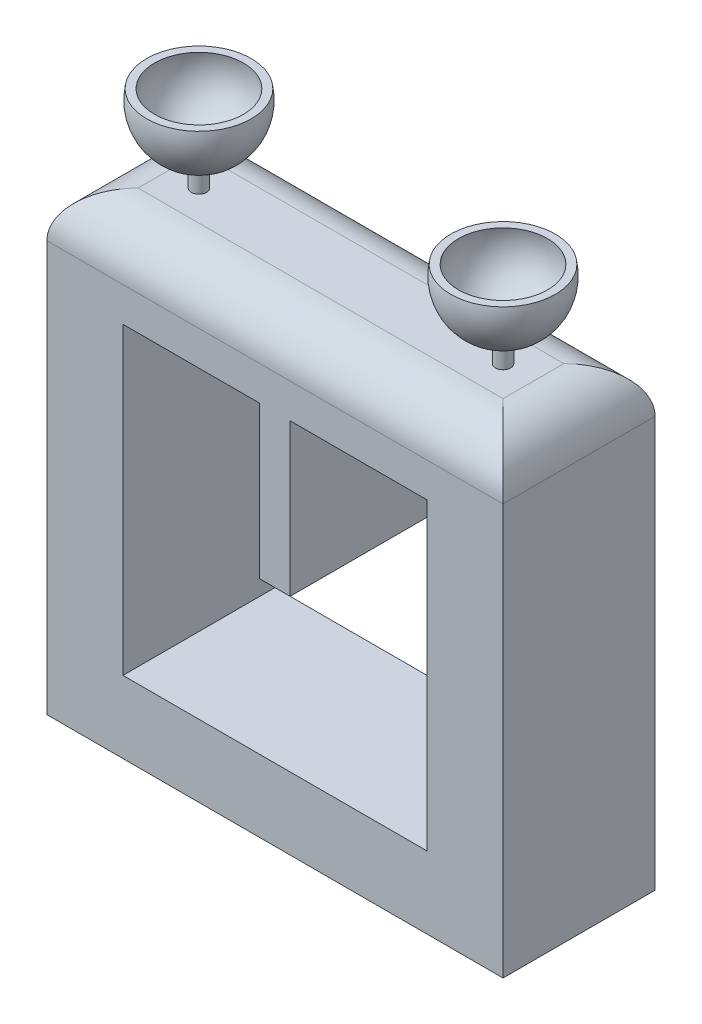
ISO-10303-21;
HEADER;
FILE_DESCRIPTION(('STEP AP214'),'2;1');
FILE_NAME('part.step','',(''),(''),'','','');
FILE_SCHEMA(('AUTOMOTIVE_DESIGN { 1 0 10303 214 1 1 1 1 }'));
ENDSEC;
DATA;
#1=APPLICATION_CONTEXT('core data for automotive mechanical design processes');
#2=APPLICATION_PROTOCOL_DEFINITION('international standard','automotive_design',2000,#1);
#3=PRODUCT_CONTEXT('',#1,'mechanical');
#4=PRODUCT('Part','Part','',(#3));
#5=PRODUCT_RELATED_PRODUCT_CATEGORY('part','',(#4));
#6=PRODUCT_DEFINITION_FORMATION('','',#4);
#7=PRODUCT_DEFINITION_CONTEXT('part definition',#1,'design');
#8=PRODUCT_DEFINITION('design','',#6,#7);
#9=PRODUCT_DEFINITION_SHAPE('','',#8);
#10=(LENGTH_UNIT() NAMED_UNIT(*) SI_UNIT(.MILLI.,.METRE.));
#11=(NAMED_UNIT(*) PLANE_ANGLE_UNIT() SI_UNIT($,.RADIAN.));
#12=(NAMED_UNIT(*) SI_UNIT($,.STERADIAN.) SOLID_ANGLE_UNIT());
#13=UNCERTAINTY_MEASURE_WITH_UNIT(LENGTH_MEASURE(1.E-05),#10,'distance_accuracy_value','');
#14=(GEOMETRIC_REPRESENTATION_CONTEXT(3) GLOBAL_UNCERTAINTY_ASSIGNED_CONTEXT((#13)) GLOBAL_UNIT_ASSIGNED_CONTEXT((#10,
#11,#12)) REPRESENTATION_CONTEXT('',''));
#15=CARTESIAN_POINT('',(0.,0.,0.));
#16=DIRECTION('',(0.,0.,1.));
#17=DIRECTION('',(1.,0.,0.));
#18=AXIS2_PLACEMENT_3D('',#15,#16,#17);
#19=CARTESIAN_POINT('',(25.,24.7382456135941,21.));
#20=DIRECTION('',(0.,1.,0.));
#21=DIRECTION('',(0.,0.,1.));
#22=AXIS2_PLACEMENT_3D('',#19,#20,#21);
#23=PLANE('',#22);
#24=DIRECTION('',(1.,0.,0.));
#25=VECTOR('',#24,1.);
#26=CARTESIAN_POINT('',(0.,24.7382456135941,10.));
#27=LINE('',#26,#25);
#28=CARTESIAN_POINT('',(15.9948213542155,24.7382456135941,10.));
#29=VERTEX_POINT('',#28);
#30=CARTESIAN_POINT('',(25.,24.7382456135941,10.));
#31=VERTEX_POINT('',#30);
#32=EDGE_CURVE('E57',#29,#31,#27,.T.);
#33=ORIENTED_EDGE('',*,*,#32,.F.);
#34=DIRECTION('',(0.,0.,1.));
#35=VECTOR('',#34,1.);
#36=CARTESIAN_POINT('',(15.9948213542155,24.7382456135941,0.));
#37=LINE('',#36,#35);
#38=CARTESIAN_POINT('',(15.9948213542155,24.7382456135941,0.));
#39=VERTEX_POINT('',#38);
#40=EDGE_CURVE('E366',#39,#29,#37,.T.);
#41=ORIENTED_EDGE('',*,*,#40,.F.);
#42=DIRECTION('',(1.,0.,0.));
#43=VECTOR('',#42,1.);
#44=CARTESIAN_POINT('',(25.,24.7382456135941,0.));
#45=LINE('',#44,#43);
#46=CARTESIAN_POINT('',(25.,24.7382456135941,0.));
#47=VERTEX_POINT('',#46);
#48=EDGE_CURVE('E173',#39,#47,#45,.T.);
#49=ORIENTED_EDGE('',*,*,#48,.T.);
#50=DIRECTION('',(0.,0.,-1.));
#51=VECTOR('',#50,1.);
#52=CARTESIAN_POINT('',(25.,24.7382456135941,21.));
#53=LINE('',#52,#51);
#54=EDGE_CURVE('E188',#31,#47,#53,.T.);
#55=ORIENTED_EDGE('',*,*,#54,.F.);
#56=EDGE_LOOP('',(#33,#41,#49,#55));
#57=FACE_BOUND('',#56,.T.);
#58=ADVANCED_FACE('F36',(#57),#23,.F.);
#59=CARTESIAN_POINT('',(25.,32.,5.));
#60=DIRECTION('',(0.,-1.,0.));
#61=DIRECTION('',(0.,0.,-1.));
#62=AXIS2_PLACEMENT_3D('',#59,#60,#61);
#63=CYLINDRICAL_SURFACE('',#62,0.5);
#64=CARTESIAN_POINT('',(25.,30.,5.));
#65=DIRECTION('',(0.,-1.,0.));
#66=DIRECTION('',(0.,0.,1.));
#67=AXIS2_PLACEMENT_3D('',#64,#65,#66);
#68=CIRCLE('',#67,0.5);
#69=CARTESIAN_POINT('',(25.,30.,5.5));
#70=VERTEX_POINT('',#69);
#71=EDGE_CURVE('E381',#70,#70,#68,.T.);
#72=ORIENTED_EDGE('',*,*,#71,.F.);
#73=EDGE_LOOP('',(#72));
#74=FACE_BOUND('',#73,.T.);
#75=CARTESIAN_POINT('',(25.,31.5358983848622,5.));
#76=DIRECTION('',(0.,1.,0.));
#77=DIRECTION('',(0.,0.,1.));
#78=AXIS2_PLACEMENT_3D('',#75,#76,#77);
#79=CIRCLE('',#78,0.5);
#80=CARTESIAN_POINT('',(25.,31.5358983848622,5.49999999999994));
#81=VERTEX_POINT('',#80);
#82=EDGE_CURVE('E40',#81,#81,#79,.F.);
#83=ORIENTED_EDGE('',*,*,#82,.T.);
#84=EDGE_LOOP('',(#83));
#85=FACE_BOUND('',#84,.T.);
#86=ADVANCED_FACE('F303',(#74,#85),#63,.T.);
#87=CARTESIAN_POINT('',(5.,32.,5.));
#88=DIRECTION('',(0.,-1.,0.));
#89=DIRECTION('',(0.,0.,-1.));
#90=AXIS2_PLACEMENT_3D('',#87,#88,#89);
#91=CYLINDRICAL_SURFACE('',#90,0.5);
#92=CARTESIAN_POINT('',(5.,30.,5.));
#93=DIRECTION('',(0.,-1.,0.));
#94=DIRECTION('',(0.,0.,-1.));
#95=AXIS2_PLACEMENT_3D('',#92,#93,#94);
#96=CIRCLE('',#95,0.5);
#97=CARTESIAN_POINT('',(5.,30.,4.5));
#98=VERTEX_POINT('',#97);
#99=EDGE_CURVE('E45',#98,#98,#96,.F.);
#100=ORIENTED_EDGE('',*,*,#99,.T.);
#101=EDGE_LOOP('',(#100));
#102=FACE_BOUND('',#101,.T.);
#103=CARTESIAN_POINT('',(5.,31.5358983848622,5.));
#104=DIRECTION('',(0.,1.,0.));
#105=DIRECTION('',(0.,0.,1.));
#106=AXIS2_PLACEMENT_3D('',#103,#104,#105);
#107=CIRCLE('',#106,0.5);
#108=CARTESIAN_POINT('',(5.,31.5358983848622,5.49999999999994));
#109=VERTEX_POINT('',#108);
#110=EDGE_CURVE('E11',#109,#109,#107,.T.);
#111=ORIENTED_EDGE('',*,*,#110,.F.);
#112=EDGE_LOOP('',(#111));
#113=FACE_BOUND('',#112,.T.);
#114=ADVANCED_FACE('F253',(#102,#113),#91,.T.);
#115=CARTESIAN_POINT('',(0.,0.,10.));
#116=DIRECTION('',(1.,0.,0.));
#117=DIRECTION('',(0.,0.,-1.));
#118=AXIS2_PLACEMENT_3D('',#115,#116,#117);
#119=PLANE('',#118);
#120=DIRECTION('',(0.,-1.,0.));
#121=VECTOR('',#120,1.);
#122=CARTESIAN_POINT('',(0.,0.,10.));
#123=LINE('',#122,#121);
#124=CARTESIAN_POINT('',(0.,27.,10.));
#125=VERTEX_POINT('',#124);
#126=CARTESIAN_POINT('',(0.,0.,10.));
#127=VERTEX_POINT('',#126);
#128=EDGE_CURVE('E203',#125,#127,#123,.T.);
#129=ORIENTED_EDGE('',*,*,#128,.F.);
#130=DIRECTION('',(0.,0.,-1.));
#131=VECTOR('',#130,1.);
#132=CARTESIAN_POINT('',(0.,27.,10.));
#133=LINE('',#132,#131);
#134=CARTESIAN_POINT('',(0.,27.,0.));
#135=VERTEX_POINT('',#134);
#136=EDGE_CURVE('E224',#125,#135,#133,.T.);
#137=ORIENTED_EDGE('',*,*,#136,.T.);
#138=DIRECTION('',(0.,-1.,0.));
#139=VECTOR('',#138,1.);
#140=CARTESIAN_POINT('',(0.,0.,0.));
#141=LINE('',#140,#139);
#142=CARTESIAN_POINT('',(0.,0.,0.));
#143=VERTEX_POINT('',#142);
#144=EDGE_CURVE('E212',#135,#143,#141,.T.);
#145=ORIENTED_EDGE('',*,*,#144,.T.);
#146=DIRECTION('',(0.,0.,-1.));
#147=VECTOR('',#146,1.);
#148=CARTESIAN_POINT('',(0.,0.,10.));
#149=LINE('',#148,#147);
#150=EDGE_CURVE('E221',#127,#143,#149,.T.);
#151=ORIENTED_EDGE('',*,*,#150,.F.);
#152=EDGE_LOOP('',(#129,#137,#145,#151));
#153=FACE_BOUND('',#152,.T.);
#154=ADVANCED_FACE('F280',(#153),#119,.F.);
#155=CARTESIAN_POINT('',(0.,0.,10.));
#156=DIRECTION('',(0.,1.,0.));
#157=DIRECTION('',(0.,0.,1.));
#158=AXIS2_PLACEMENT_3D('',#155,#156,#157);
#159=PLANE('',#158);
#160=DIRECTION('',(1.,0.,0.));
#161=VECTOR('',#160,1.);
#162=CARTESIAN_POINT('',(0.,0.,0.));
#163=LINE('',#162,#161);
#164=CARTESIAN_POINT('',(30.,0.,0.));
#165=VERTEX_POINT('',#164);
#166=EDGE_CURVE('E214',#143,#165,#163,.T.);
#167=ORIENTED_EDGE('',*,*,#166,.T.);
#168=DIRECTION('',(0.,0.,-1.));
#169=VECTOR('',#168,1.);
#170=CARTESIAN_POINT('',(30.,0.,10.));
#171=LINE('',#170,#169);
#172=CARTESIAN_POINT('',(30.,0.,10.));
#173=VERTEX_POINT('',#172);
#174=EDGE_CURVE('E211',#173,#165,#171,.T.);
#175=ORIENTED_EDGE('',*,*,#174,.F.);
#176=DIRECTION('',(1.,0.,0.));
#177=VECTOR('',#176,1.);
#178=CARTESIAN_POINT('',(0.,0.,10.));
#179=LINE('',#178,#177);
#180=EDGE_CURVE('E205',#127,#173,#179,.T.);
#181=ORIENTED_EDGE('',*,*,#180,.F.);
#182=ORIENTED_EDGE('',*,*,#150,.T.);
#183=EDGE_LOOP('',(#167,#175,#181,#182));
#184=FACE_BOUND('',#183,.T.);
#185=ADVANCED_FACE('F286',(#184),#159,.F.);
#186=CARTESIAN_POINT('',(30.,0.,10.));
#187=DIRECTION('',(-1.,0.,0.));
#188=DIRECTION('',(0.,0.,1.));
#189=AXIS2_PLACEMENT_3D('',#186,#187,#188);
#190=PLANE('',#189);
#191=DIRECTION('',(0.,1.,0.));
#192=VECTOR('',#191,1.);
#193=CARTESIAN_POINT('',(30.,0.,0.));
#194=LINE('',#193,#192);
#195=CARTESIAN_POINT('',(30.,27.,0.));
#196=VERTEX_POINT('',#195);
#197=EDGE_CURVE('E206',#165,#196,#194,.T.);
#198=ORIENTED_EDGE('',*,*,#197,.T.);
#199=DIRECTION('',(0.,0.,-1.));
#200=VECTOR('',#199,1.);
#201=CARTESIAN_POINT('',(30.,27.,10.));
#202=LINE('',#201,#200);
#203=CARTESIAN_POINT('',(30.,27.,10.));
#204=VERTEX_POINT('',#203);
#205=EDGE_CURVE('E240',#196,#204,#202,.F.);
#206=ORIENTED_EDGE('',*,*,#205,.T.);
#207=DIRECTION('',(0.,1.,0.));
#208=VECTOR('',#207,1.);
#209=CARTESIAN_POINT('',(30.,0.,10.));
#210=LINE('',#209,#208);
#211=EDGE_CURVE('E208',#173,#204,#210,.T.);
#212=ORIENTED_EDGE('',*,*,#211,.F.);
#213=ORIENTED_EDGE('',*,*,#174,.T.);
#214=EDGE_LOOP('',(#198,#206,#212,#213));
#215=FACE_BOUND('',#214,.T.);
#216=ADVANCED_FACE('F260',(#215),#190,.F.);
#217=CARTESIAN_POINT('',(0.,30.,10.));
#218=DIRECTION('',(0.,-1.,0.));
#219=DIRECTION('',(0.,0.,-1.));
#220=AXIS2_PLACEMENT_3D('',#217,#218,#219);
#221=PLANE('',#220);
#222=ORIENTED_EDGE('',*,*,#71,.T.);
#223=EDGE_LOOP('',(#222));
#224=FACE_BOUND('',#223,.T.);
#225=ORIENTED_EDGE('',*,*,#99,.F.);
#226=EDGE_LOOP('',(#225));
#227=FACE_BOUND('',#226,.T.);
#228=DIRECTION('',(-1.,0.,0.));
#229=VECTOR('',#228,1.);
#230=CARTESIAN_POINT('',(0.,30.,3.));
#231=LINE('',#230,#229);
#232=CARTESIAN_POINT('',(27.,30.,3.));
#233=VERTEX_POINT('',#232);
#234=CARTESIAN_POINT('',(3.,30.,3.));
#235=VERTEX_POINT('',#234);
#236=EDGE_CURVE('E231',#233,#235,#231,.T.);
#237=ORIENTED_EDGE('',*,*,#236,.T.);
#238=DIRECTION('',(0.,0.,-1.));
#239=VECTOR('',#238,1.);
#240=CARTESIAN_POINT('',(3.,30.,10.));
#241=LINE('',#240,#239);
#242=CARTESIAN_POINT('',(3.,30.,7.));
#243=VERTEX_POINT('',#242);
#244=EDGE_CURVE('E233',#235,#243,#241,.F.);
#245=ORIENTED_EDGE('',*,*,#244,.T.);
#246=DIRECTION('',(-1.,0.,0.));
#247=VECTOR('',#246,1.);
#248=CARTESIAN_POINT('',(0.,30.,7.));
#249=LINE('',#248,#247);
#250=CARTESIAN_POINT('',(27.,30.,7.));
#251=VERTEX_POINT('',#250);
#252=EDGE_CURVE('E229',#243,#251,#249,.F.);
#253=ORIENTED_EDGE('',*,*,#252,.T.);
#254=DIRECTION('',(0.,0.,-1.));
#255=VECTOR('',#254,1.);
#256=CARTESIAN_POINT('',(27.,30.,10.));
#257=LINE('',#256,#255);
#258=EDGE_CURVE('E227',#251,#233,#257,.T.);
#259=ORIENTED_EDGE('',*,*,#258,.T.);
#260=EDGE_LOOP('',(#237,#245,#253,#259));
#261=FACE_BOUND('',#260,.T.);
#262=ADVANCED_FACE('F256',(#224,#227,#261),#221,.F.);
#263=CARTESIAN_POINT('',(0.,0.,10.));
#264=DIRECTION('',(0.,0.,-1.));
#265=DIRECTION('',(-1.,0.,0.));
#266=AXIS2_PLACEMENT_3D('',#263,#264,#265);
#267=PLANE('',#266);
#268=DIRECTION('',(-1.,0.,0.));
#269=VECTOR('',#268,1.);
#270=CARTESIAN_POINT('',(0.,4.73824561359411,10.));
#271=LINE('',#270,#269);
#272=CARTESIAN_POINT('',(25.,4.73824561359411,10.));
#273=VERTEX_POINT('',#272);
#274=CARTESIAN_POINT('',(5.,4.73824561359411,10.));
#275=VERTEX_POINT('',#274);
#276=EDGE_CURVE('E196',#273,#275,#271,.T.);
#277=ORIENTED_EDGE('',*,*,#276,.T.);
#278=DIRECTION('',(0.,1.,0.));
#279=VECTOR('',#278,1.);
#280=CARTESIAN_POINT('',(5.,0.,10.));
#281=LINE('',#280,#279);
#282=CARTESIAN_POINT('',(5.,24.7382456135941,10.));
#283=VERTEX_POINT('',#282);
#284=EDGE_CURVE('E199',#275,#283,#281,.T.);
#285=ORIENTED_EDGE('',*,*,#284,.T.);
#286=CARTESIAN_POINT('',(13.9948213542154,24.7382456135941,10.));
#287=VERTEX_POINT('',#286);
#288=EDGE_CURVE('E192',#283,#287,#27,.T.);
#289=ORIENTED_EDGE('',*,*,#288,.T.);
#290=DIRECTION('',(0.,-1.,0.));
#291=VECTOR('',#290,1.);
#292=CARTESIAN_POINT('',(13.9948213542154,24.7382456135941,10.));
#293=LINE('',#292,#291);
#294=CARTESIAN_POINT('',(13.9948213542154,14.7382456135941,10.));
#295=VERTEX_POINT('',#294);
#296=EDGE_CURVE('E150',#287,#295,#293,.T.);
#297=ORIENTED_EDGE('',*,*,#296,.T.);
#298=DIRECTION('',(1.,0.,0.));
#299=VECTOR('',#298,1.);
#300=CARTESIAN_POINT('',(13.9948213542154,14.7382456135941,10.));
#301=LINE('',#300,#299);
#302=CARTESIAN_POINT('',(15.9948213542155,14.7382456135941,10.));
#303=VERTEX_POINT('',#302);
#304=EDGE_CURVE('E367',#295,#303,#301,.T.);
#305=ORIENTED_EDGE('',*,*,#304,.T.);
#306=DIRECTION('',(0.,1.,0.));
#307=VECTOR('',#306,1.);
#308=CARTESIAN_POINT('',(15.9948213542155,24.7382456135941,10.));
#309=LINE('',#308,#307);
#310=EDGE_CURVE('E52',#303,#29,#309,.T.);
#311=ORIENTED_EDGE('',*,*,#310,.T.);
#312=ORIENTED_EDGE('',*,*,#32,.T.);
#313=DIRECTION('',(0.,-1.,0.));
#314=VECTOR('',#313,1.);
#315=CARTESIAN_POINT('',(25.,0.,10.));
#316=LINE('',#315,#314);
#317=EDGE_CURVE('E194',#31,#273,#316,.T.);
#318=ORIENTED_EDGE('',*,*,#317,.T.);
#319=EDGE_LOOP('',(#277,#285,#289,#297,#305,#311,#312,#318));
#320=FACE_BOUND('',#319,.T.);
#321=ORIENTED_EDGE('',*,*,#211,.T.);
#322=DIRECTION('',(-1.,0.,0.));
#323=VECTOR('',#322,1.);
#324=CARTESIAN_POINT('',(0.,27.,10.));
#325=LINE('',#324,#323);
#326=EDGE_CURVE('E238',#204,#125,#325,.T.);
#327=ORIENTED_EDGE('',*,*,#326,.T.);
#328=ORIENTED_EDGE('',*,*,#128,.T.);
#329=ORIENTED_EDGE('',*,*,#180,.T.);
#330=EDGE_LOOP('',(#321,#327,#328,#329));
#331=FACE_BOUND('',#330,.T.);
#332=ADVANCED_FACE('F259',(#320,#331),#267,.F.);
#333=CARTESIAN_POINT('',(0.,0.,0.));
#334=DIRECTION('',(0.,0.,-1.));
#335=DIRECTION('',(-1.,0.,0.));
#336=AXIS2_PLACEMENT_3D('',#333,#334,#335);
#337=PLANE('',#336);
#338=DIRECTION('',(0.,1.,0.));
#339=VECTOR('',#338,1.);
#340=CARTESIAN_POINT('',(5.,24.7382456135941,0.));
#341=LINE('',#340,#339);
#342=CARTESIAN_POINT('',(5.,4.73824561359411,0.));
#343=VERTEX_POINT('',#342);
#344=CARTESIAN_POINT('',(5.,24.7382456135941,0.));
#345=VERTEX_POINT('',#344);
#346=EDGE_CURVE('E178',#343,#345,#341,.T.);
#347=ORIENTED_EDGE('',*,*,#346,.F.);
#348=DIRECTION('',(-1.,0.,0.));
#349=VECTOR('',#348,1.);
#350=CARTESIAN_POINT('',(25.,4.73824561359411,0.));
#351=LINE('',#350,#349);
#352=CARTESIAN_POINT('',(25.,4.73824561359411,0.));
#353=VERTEX_POINT('',#352);
#354=EDGE_CURVE('E176',#353,#343,#351,.T.);
#355=ORIENTED_EDGE('',*,*,#354,.F.);
#356=DIRECTION('',(0.,-1.,0.));
#357=VECTOR('',#356,1.);
#358=CARTESIAN_POINT('',(25.,24.7382456135941,0.));
#359=LINE('',#358,#357);
#360=EDGE_CURVE('E172',#47,#353,#359,.T.);
#361=ORIENTED_EDGE('',*,*,#360,.F.);
#362=ORIENTED_EDGE('',*,*,#48,.F.);
#363=DIRECTION('',(0.,1.,0.));
#364=VECTOR('',#363,1.);
#365=CARTESIAN_POINT('',(15.9948213542155,24.7382456135941,0.));
#366=LINE('',#365,#364);
#367=CARTESIAN_POINT('',(15.9948213542155,14.7382456135941,0.));
#368=VERTEX_POINT('',#367);
#369=EDGE_CURVE('E155',#368,#39,#366,.T.);
#370=ORIENTED_EDGE('',*,*,#369,.F.);
#371=DIRECTION('',(1.,0.,0.));
#372=VECTOR('',#371,1.);
#373=CARTESIAN_POINT('',(13.9948213542154,14.7382456135941,0.));
#374=LINE('',#373,#372);
#375=CARTESIAN_POINT('',(13.9948213542154,14.7382456135941,0.));
#376=VERTEX_POINT('',#375);
#377=EDGE_CURVE('E166',#376,#368,#374,.T.);
#378=ORIENTED_EDGE('',*,*,#377,.F.);
#379=DIRECTION('',(0.,-1.,0.));
#380=VECTOR('',#379,1.);
#381=CARTESIAN_POINT('',(13.9948213542154,24.7382456135941,0.));
#382=LINE('',#381,#380);
#383=CARTESIAN_POINT('',(13.9948213542154,24.7382456135941,0.));
#384=VERTEX_POINT('',#383);
#385=EDGE_CURVE('E148',#384,#376,#382,.T.);
#386=ORIENTED_EDGE('',*,*,#385,.F.);
#387=EDGE_CURVE('E163',#345,#384,#45,.T.);
#388=ORIENTED_EDGE('',*,*,#387,.F.);
#389=EDGE_LOOP('',(#347,#355,#361,#362,#370,#378,#386,#388));
#390=FACE_BOUND('',#389,.T.);
#391=ORIENTED_EDGE('',*,*,#144,.F.);
#392=DIRECTION('',(-1.,0.,0.));
#393=VECTOR('',#392,1.);
#394=CARTESIAN_POINT('',(30.,27.,0.));
#395=LINE('',#394,#393);
#396=EDGE_CURVE('E236',#135,#196,#395,.F.);
#397=ORIENTED_EDGE('',*,*,#396,.T.);
#398=ORIENTED_EDGE('',*,*,#197,.F.);
#399=ORIENTED_EDGE('',*,*,#166,.F.);
#400=EDGE_LOOP('',(#391,#397,#398,#399));
#401=FACE_BOUND('',#400,.T.);
#402=ADVANCED_FACE('F161',(#390,#401),#337,.T.);
#403=CARTESIAN_POINT('',(27.,27.,10.));
#404=DIRECTION('',(0.,0.,-1.));
#405=DIRECTION('',(-1.,0.,0.));
#406=AXIS2_PLACEMENT_3D('',#403,#404,#405);
#407=CYLINDRICAL_SURFACE('',#406,3.);
#408=CARTESIAN_POINT('',(27.,27.,3.));
#409=DIRECTION('',(-0.707106781186547,0.,-0.707106781186547));
#410=DIRECTION('',(0.707106781186547,0.,-0.707106781186547));
#411=AXIS2_PLACEMENT_3D('',#408,#409,#410);
#412=ELLIPSE('',#411,4.24264068711928,3.);
#413=EDGE_CURVE('E245',#233,#196,#412,.T.);
#414=ORIENTED_EDGE('',*,*,#413,.F.);
#415=ORIENTED_EDGE('',*,*,#258,.F.);
#416=CARTESIAN_POINT('',(27.,27.,7.));
#417=DIRECTION('',(0.707106781186547,0.,-0.707106781186547));
#418=DIRECTION('',(-0.707106781186547,0.,-0.707106781186547));
#419=AXIS2_PLACEMENT_3D('',#416,#417,#418);
#420=ELLIPSE('',#419,4.24264068711928,3.);
#421=EDGE_CURVE('E215',#204,#251,#420,.F.);
#422=ORIENTED_EDGE('',*,*,#421,.F.);
#423=ORIENTED_EDGE('',*,*,#205,.F.);
#424=EDGE_LOOP('',(#414,#415,#422,#423));
#425=FACE_BOUND('',#424,.T.);
#426=ADVANCED_FACE('F38',(#425),#407,.T.);
#427=CARTESIAN_POINT('',(0.,27.,7.));
#428=DIRECTION('',(-1.,0.,0.));
#429=DIRECTION('',(0.,0.,1.));
#430=AXIS2_PLACEMENT_3D('',#427,#428,#429);
#431=CYLINDRICAL_SURFACE('',#430,3.);
#432=ORIENTED_EDGE('',*,*,#421,.T.);
#433=ORIENTED_EDGE('',*,*,#252,.F.);
#434=CARTESIAN_POINT('',(3.,27.,7.));
#435=DIRECTION('',(-0.707106781186547,0.,-0.707106781186547));
#436=DIRECTION('',(-0.707106781186547,0.,0.707106781186547));
#437=AXIS2_PLACEMENT_3D('',#434,#435,#436);
#438=ELLIPSE('',#437,4.24264068711928,3.);
#439=EDGE_CURVE('E243',#125,#243,#438,.T.);
#440=ORIENTED_EDGE('',*,*,#439,.F.);
#441=ORIENTED_EDGE('',*,*,#326,.F.);
#442=EDGE_LOOP('',(#432,#433,#440,#441));
#443=FACE_BOUND('',#442,.T.);
#444=ADVANCED_FACE('F292',(#443),#431,.T.);
#445=CARTESIAN_POINT('',(0.,27.,3.));
#446=DIRECTION('',(1.,0.,0.));
#447=DIRECTION('',(0.,0.,-1.));
#448=AXIS2_PLACEMENT_3D('',#445,#446,#447);
#449=CYLINDRICAL_SURFACE('',#448,3.);
#450=ORIENTED_EDGE('',*,*,#413,.T.);
#451=ORIENTED_EDGE('',*,*,#396,.F.);
#452=CARTESIAN_POINT('',(3.,27.,3.));
#453=DIRECTION('',(0.707106781186547,0.,-0.707106781186547));
#454=DIRECTION('',(0.707106781186547,0.,0.707106781186547));
#455=AXIS2_PLACEMENT_3D('',#452,#453,#454);
#456=ELLIPSE('',#455,4.24264068711928,3.);
#457=EDGE_CURVE('E202',#235,#135,#456,.F.);
#458=ORIENTED_EDGE('',*,*,#457,.F.);
#459=ORIENTED_EDGE('',*,*,#236,.F.);
#460=EDGE_LOOP('',(#450,#451,#458,#459));
#461=FACE_BOUND('',#460,.T.);
#462=ADVANCED_FACE('F275',(#461),#449,.T.);
#463=CARTESIAN_POINT('',(3.,27.,10.));
#464=DIRECTION('',(0.,0.,-1.));
#465=DIRECTION('',(-1.,0.,0.));
#466=AXIS2_PLACEMENT_3D('',#463,#464,#465);
#467=CYLINDRICAL_SURFACE('',#466,3.);
#468=ORIENTED_EDGE('',*,*,#439,.T.);
#469=ORIENTED_EDGE('',*,*,#244,.F.);
#470=ORIENTED_EDGE('',*,*,#457,.T.);
#471=ORIENTED_EDGE('',*,*,#136,.F.);
#472=EDGE_LOOP('',(#468,#469,#470,#471));
#473=FACE_BOUND('',#472,.T.);
#474=ADVANCED_FACE('F270',(#473),#467,.T.);
#475=CARTESIAN_POINT('',(5.,24.7382456135941,21.));
#476=DIRECTION('',(-1.,0.,0.));
#477=DIRECTION('',(0.,-1.,0.));
#478=AXIS2_PLACEMENT_3D('',#475,#476,#477);
#479=PLANE('',#478);
#480=DIRECTION('',(0.,0.,-1.));
#481=VECTOR('',#480,1.);
#482=CARTESIAN_POINT('',(5.,4.73824561359411,21.));
#483=LINE('',#482,#481);
#484=EDGE_CURVE('E184',#275,#343,#483,.T.);
#485=ORIENTED_EDGE('',*,*,#484,.T.);
#486=ORIENTED_EDGE('',*,*,#346,.T.);
#487=DIRECTION('',(0.,0.,-1.));
#488=VECTOR('',#487,1.);
#489=CARTESIAN_POINT('',(5.,24.7382456135941,21.));
#490=LINE('',#489,#488);
#491=EDGE_CURVE('E171',#283,#345,#490,.T.);
#492=ORIENTED_EDGE('',*,*,#491,.F.);
#493=ORIENTED_EDGE('',*,*,#284,.F.);
#494=EDGE_LOOP('',(#485,#486,#492,#493));
#495=FACE_BOUND('',#494,.T.);
#496=ADVANCED_FACE('F328',(#495),#479,.F.);
#497=CARTESIAN_POINT('',(25.,4.73824561359411,21.));
#498=DIRECTION('',(0.,-1.,0.));
#499=DIRECTION('',(0.,0.,-1.));
#500=AXIS2_PLACEMENT_3D('',#497,#498,#499);
#501=PLANE('',#500);
#502=DIRECTION('',(0.,0.,-1.));
#503=VECTOR('',#502,1.);
#504=CARTESIAN_POINT('',(25.,4.73824561359411,21.));
#505=LINE('',#504,#503);
#506=EDGE_CURVE('E186',#273,#353,#505,.T.);
#507=ORIENTED_EDGE('',*,*,#506,.T.);
#508=ORIENTED_EDGE('',*,*,#354,.T.);
#509=ORIENTED_EDGE('',*,*,#484,.F.);
#510=ORIENTED_EDGE('',*,*,#276,.F.);
#511=EDGE_LOOP('',(#507,#508,#509,#510));
#512=FACE_BOUND('',#511,.T.);
#513=ADVANCED_FACE('F323',(#512),#501,.F.);
#514=CARTESIAN_POINT('',(25.,24.7382456135941,21.));
#515=DIRECTION('',(1.,0.,0.));
#516=DIRECTION('',(0.,1.,0.));
#517=AXIS2_PLACEMENT_3D('',#514,#515,#516);
#518=PLANE('',#517);
#519=ORIENTED_EDGE('',*,*,#54,.T.);
#520=ORIENTED_EDGE('',*,*,#360,.T.);
#521=ORIENTED_EDGE('',*,*,#506,.F.);
#522=ORIENTED_EDGE('',*,*,#317,.F.);
#523=EDGE_LOOP('',(#519,#520,#521,#522));
#524=FACE_BOUND('',#523,.T.);
#525=ADVANCED_FACE('F315',(#524),#518,.F.);
#526=ORIENTED_EDGE('',*,*,#387,.T.);
#527=DIRECTION('',(0.,0.,1.));
#528=VECTOR('',#527,1.);
#529=CARTESIAN_POINT('',(13.9948213542154,24.7382456135941,0.));
#530=LINE('',#529,#528);
#531=EDGE_CURVE('E145',#384,#287,#530,.T.);
#532=ORIENTED_EDGE('',*,*,#531,.T.);
#533=ORIENTED_EDGE('',*,*,#288,.F.);
#534=ORIENTED_EDGE('',*,*,#491,.T.);
#535=EDGE_LOOP('',(#526,#532,#533,#534));
#536=FACE_BOUND('',#535,.T.);
#537=ADVANCED_FACE('F169',(#536),#23,.F.);
#538=CARTESIAN_POINT('',(5.,35.,4.99999999999998));
#539=DIRECTION('',(0.,1.,0.));
#540=DIRECTION('',(0.,0.,1.));
#541=AXIS2_PLACEMENT_3D('',#538,#539,#540);
#542=SPHERICAL_SURFACE('',#541,3.50000000000001);
#543=CARTESIAN_POINT('',(5.,35.6607802552537,5.00000000000002));
#544=DIRECTION('',(0.,1.,0.));
#545=DIRECTION('',(0.,0.,1.));
#546=AXIS2_PLACEMENT_3D('',#543,#544,#545);
#547=CIRCLE('',#546,3.43705825587327);
#548=CARTESIAN_POINT('',(5.,35.6607802552537,8.43705825587329));
#549=VERTEX_POINT('',#548);
#550=EDGE_CURVE('E386',#549,#549,#547,.T.);
#551=CARTESIAN_POINT('',(5.,35.6607802552537,8.43705825587329));
#552=CARTESIAN_POINT('',(5.,35.6028737834654,8.44819226325449));
#553=CARTESIAN_POINT('',(5.,35.5446855826934,8.45786021951));
#554=CARTESIAN_POINT('',(5.,35.42789517406,8.47424528110039));
#555=CARTESIAN_POINT('',(5.,35.3692929661986,8.48096238643527));
#556=CARTESIAN_POINT('',(5.,35.2518239942646,8.49142699751516));
#557=CARTESIAN_POINT('',(5.,35.192957230192,8.49517450326018));
#558=CARTESIAN_POINT('',(5.,35.0751095557404,8.49969077051598));
#559=CARTESIAN_POINT('',(5.,35.0161286453614,8.50045953202676));
#560=CARTESIAN_POINT('',(5.,34.8982033038216,8.49901623299086));
#561=CARTESIAN_POINT('',(5.,34.8392588726607,8.49680417244417));
#562=CARTESIAN_POINT('',(5.,34.7215570422535,8.48940490969809));
#563=CARTESIAN_POINT('',(5.,34.662799643007,8.48421770749869));
#564=CARTESIAN_POINT('',(5.,34.5456219459808,8.47088140173183));
#565=CARTESIAN_POINT('',(5.,34.4872016482011,8.46273229816436));
#566=CARTESIAN_POINT('',(5.,34.3708473641393,8.44349300526899));
#567=CARTESIAN_POINT('',(5.,34.3129133778572,8.43240281594108));
#568=CARTESIAN_POINT('',(5.,34.1976796843553,8.40730967609177));
#569=CARTESIAN_POINT('',(5.,34.1403799771353,8.39330672557036));
#570=CARTESIAN_POINT('',(5.,34.0265611894316,8.36242382805393));
#571=CARTESIAN_POINT('',(5.,33.9700421089478,8.34554388105891));
#572=CARTESIAN_POINT('',(5.,33.8579289285846,8.30895010317473));
#573=CARTESIAN_POINT('',(5.,33.802334828705,8.28923627228559));
#574=CARTESIAN_POINT('',(5.,33.6922136009576,8.24702507719348));
#575=CARTESIAN_POINT('',(5.,33.6376864730897,8.22452771299053));
#576=CARTESIAN_POINT('',(5.,33.5298384556461,8.17680691118484));
#577=CARTESIAN_POINT('',(5.,33.4765175660704,8.15158347358212));
#578=CARTESIAN_POINT('',(5.,33.3712182106713,8.09847494748605));
#579=CARTESIAN_POINT('',(5.,33.3192397448479,8.0705898589927));
#580=CARTESIAN_POINT('',(5.,33.2167579937649,8.01222925167497));
#581=CARTESIAN_POINT('',(5.,33.1662547085052,7.98175373285059));
#582=CARTESIAN_POINT('',(5.,33.0668523076416,7.91829010157956));
#583=CARTESIAN_POINT('',(5.,33.0179531920377,7.88530198913292));
#584=CARTESIAN_POINT('',(5.,32.9218840224109,7.81689742467434));
#585=CARTESIAN_POINT('',(5.,32.8747139683881,7.78148097266241));
#586=CARTESIAN_POINT('',(5.,32.7822233976985,7.70831018528748));
#587=CARTESIAN_POINT('',(5.,32.7369028810318,7.67055584992448));
#588=CARTESIAN_POINT('',(5.,32.648227136976,7.59280572318707));
#589=CARTESIAN_POINT('',(5.,32.6048719095868,7.55280993181265));
#590=CARTESIAN_POINT('',(5.,32.5202374765142,7.470679045235));
#591=CARTESIAN_POINT('',(5.,32.4789582708307,7.42854395003178));
#592=CARTESIAN_POINT('',(5.,32.398581311287,7.34224207191773));
#593=CARTESIAN_POINT('',(5.,32.3594835574268,7.29807528900691));
#594=CARTESIAN_POINT('',(5.,32.2835693600556,7.20782284067893));
#595=CARTESIAN_POINT('',(5.,32.2467529165447,7.16173717526177));
#596=CARTESIAN_POINT('',(5.,32.1754953717783,7.06776466808614));
#597=CARTESIAN_POINT('',(5.,32.1410542705229,7.01987782632767));
#598=CARTESIAN_POINT('',(5.,32.0746353753226,6.92242527298129));
#599=CARTESIAN_POINT('',(5.,32.0426575813778,6.87285956139337));
#600=CARTESIAN_POINT('',(5.,31.9812469745846,6.77217586281757));
#601=CARTESIAN_POINT('',(5.,31.9518141617363,6.72105787582969));
#602=CARTESIAN_POINT('',(5.,31.8955686901133,6.61740018565401));
#603=CARTESIAN_POINT('',(5.,31.8687560313387,6.56486048246622));
#604=CARTESIAN_POINT('',(5.,31.8178193515386,6.45849354971543));
#605=CARTESIAN_POINT('',(5.,31.7936953305131,6.40466632015245));
#606=CARTESIAN_POINT('',(5.,31.7481975325942,6.29586181493811));
#607=CARTESIAN_POINT('',(5.,31.7268237557007,6.24088453928677));
#608=CARTESIAN_POINT('',(5.,31.6868810665987,6.12992035192572));
#609=CARTESIAN_POINT('',(5.,31.6683121543902,6.07393344021601));
#610=CARTESIAN_POINT('',(5.,31.6340265077147,5.96109299766272));
#611=CARTESIAN_POINT('',(5.,31.6183097732477,5.90423946681915));
#612=CARTESIAN_POINT('',(5.,31.5897690466118,5.78981091105017));
#613=CARTESIAN_POINT('',(5.,31.5769450544429,5.73223588612477));
#614=CARTESIAN_POINT('',(5.,31.554220987666,5.61651170290794));
#615=CARTESIAN_POINT('',(5.,31.5443209130581,5.5583625446165));
#616=CARTESIAN_POINT('',(5.,31.5358983848622,5.49999999999994));
#617=B_SPLINE_CURVE_WITH_KNOTS('',3,(#551,#552,#553,#554,#555,#556,#557,#558,#559,#560,#561,
#562,#563,#564,#565,#566,#567,#568,#569,#570,#571,#572,#573,#574,#575,#576,#577,#578,#579,#580,
#581,#582,#583,#584,#585,#586,#587,#588,#589,#590,#591,#592,#593,#594,#595,#596,#597,#598,#599,
#600,#601,#602,#603,#604,#605,#606,#607,#608,#609,#610,#611,#612,#613,#614,#615,#616),
.UNSPECIFIED.,.F.,.F.,(4,2,2,2,2,2,2,2,2,2,2,2,2,2,2,2,2,2,2,2,2,2,2,2,2,2,2,2,2,2,2,2,4),(0.,
0.176882440733711,0.353764881467424,0.530647322201141,0.707529762934853,0.884412203668565,
1.06129464440228,1.238177085136,1.41505952586971,1.59194196660342,1.76882440733714,
1.94570684807085,2.12258928880456,2.29947172953828,2.476354170272,2.65323661100571,
2.83011905173943,3.00700149247314,3.18388393320685,3.36076637394057,3.53764881467428,
3.714531255408,3.89141369614171,4.06829613687542,4.24517857760914,4.42206101834285,
4.59894345907657,4.77582589981028,4.952708340544,5.12959078127771,5.30647322201142,
5.48335566274514,5.66023810347885),.UNSPECIFIED.);
#618=EDGE_CURVE('BSEAM314',#549,#109,#617,.T.);
#619=ORIENTED_EDGE('',*,*,#550,.F.);
#620=ORIENTED_EDGE('',*,*,#110,.T.);
#621=ORIENTED_EDGE('',*,*,#618,.T.);
#622=ORIENTED_EDGE('',*,*,#618,.F.);
#623=EDGE_LOOP('',(#619,#621,#620,#622));
#624=FACE_BOUND('',#623,.T.);
#625=ADVANCED_FACE('F314',(#624),#542,.T.);
#626=CARTESIAN_POINT('',(5.,35.,4.99999999999998));
#627=DIRECTION('',(0.,1.,0.));
#628=DIRECTION('',(0.,0.,1.));
#629=AXIS2_PLACEMENT_3D('',#626,#627,#628);
#630=SPHERICAL_SURFACE('',#629,3.);
#631=CARTESIAN_POINT('',(5.,32.,4.99999999999998));
#632=VERTEX_POINT('',#631);
#633=VERTEX_LOOP('',#632);
#634=FACE_BOUND('',#633,.T.);
#635=CARTESIAN_POINT('',(5.,35.6607802552537,5.00000000000002));
#636=DIRECTION('',(0.,1.,0.));
#637=DIRECTION('',(0.,0.,1.));
#638=AXIS2_PLACEMENT_3D('',#635,#636,#637);
#639=CIRCLE('',#638,2.92632353889085);
#640=CARTESIAN_POINT('',(5.,35.6607802552537,7.92632353889087));
#641=VERTEX_POINT('',#640);
#642=EDGE_CURVE('E384',#641,#641,#639,.T.);
#643=ORIENTED_EDGE('',*,*,#642,.T.);
#644=EDGE_LOOP('',(#643));
#645=FACE_BOUND('',#644,.T.);
#646=ADVANCED_FACE('F320',(#634,#645),#630,.F.);
#647=CARTESIAN_POINT('',(5.,35.6607802552537,8.4370582558733));
#648=DIRECTION('',(0.,-1.,0.));
#649=DIRECTION('',(0.,0.,-1.));
#650=AXIS2_PLACEMENT_3D('',#647,#648,#649);
#651=PLANE('',#650);
#652=ORIENTED_EDGE('',*,*,#642,.F.);
#653=EDGE_LOOP('',(#652));
#654=FACE_BOUND('',#653,.T.);
#655=ORIENTED_EDGE('',*,*,#550,.T.);
#656=EDGE_LOOP('',(#655));
#657=FACE_BOUND('',#656,.T.);
#658=ADVANCED_FACE('F335',(#654,#657),#651,.F.);
#659=CARTESIAN_POINT('',(25.,35.,4.99999999999998));
#660=DIRECTION('',(0.,1.,0.));
#661=DIRECTION('',(0.,0.,1.));
#662=AXIS2_PLACEMENT_3D('',#659,#660,#661);
#663=SPHERICAL_SURFACE('',#662,3.);
#664=CARTESIAN_POINT('',(25.,32.,4.99999999999998));
#665=VERTEX_POINT('',#664);
#666=VERTEX_LOOP('',#665);
#667=FACE_BOUND('',#666,.T.);
#668=CARTESIAN_POINT('',(25.,35.6607802552537,5.00000000000002));
#669=DIRECTION('',(0.,-1.,0.));
#670=DIRECTION('',(0.,0.,1.));
#671=AXIS2_PLACEMENT_3D('',#668,#669,#670);
#672=CIRCLE('',#671,2.92632353889085);
#673=CARTESIAN_POINT('',(25.,35.6607802552537,7.92632353889087));
#674=VERTEX_POINT('',#673);
#675=EDGE_CURVE('E373',#674,#674,#672,.T.);
#676=ORIENTED_EDGE('',*,*,#675,.F.);
#677=EDGE_LOOP('',(#676));
#678=FACE_BOUND('',#677,.T.);
#679=ADVANCED_FACE('F339',(#667,#678),#663,.F.);
#680=CARTESIAN_POINT('',(25.,35.,4.99999999999998));
#681=DIRECTION('',(0.,1.,0.));
#682=DIRECTION('',(0.,0.,1.));
#683=AXIS2_PLACEMENT_3D('',#680,#681,#682);
#684=SPHERICAL_SURFACE('',#683,3.50000000000001);
#685=CARTESIAN_POINT('',(25.,35.6607802552537,5.00000000000002));
#686=DIRECTION('',(0.,-1.,0.));
#687=DIRECTION('',(0.,0.,1.));
#688=AXIS2_PLACEMENT_3D('',#685,#686,#687);
#689=CIRCLE('',#688,3.43705825587327);
#690=CARTESIAN_POINT('',(25.,35.6607802552537,8.43705825587329));
#691=VERTEX_POINT('',#690);
#692=EDGE_CURVE('E378',#691,#691,#689,.T.);
#693=CARTESIAN_POINT('',(25.,31.5358983848622,5.49999999999994));
#694=CARTESIAN_POINT('',(25.,31.5443209130581,5.5583625446165));
#695=CARTESIAN_POINT('',(25.,31.554220987666,5.61651170290794));
#696=CARTESIAN_POINT('',(25.,31.5769450544429,5.73223588612477));
#697=CARTESIAN_POINT('',(25.,31.5897690466118,5.78981091105017));
#698=CARTESIAN_POINT('',(25.,31.6183097732477,5.90423946681915));
#699=CARTESIAN_POINT('',(25.,31.6340265077147,5.96109299766272));
#700=CARTESIAN_POINT('',(25.,31.6683121543902,6.07393344021601));
#701=CARTESIAN_POINT('',(25.,31.6868810665987,6.12992035192572));
#702=CARTESIAN_POINT('',(25.,31.7268237557007,6.24088453928677));
#703=CARTESIAN_POINT('',(25.,31.7481975325942,6.29586181493811));
#704=CARTESIAN_POINT('',(25.,31.7936953305131,6.40466632015245));
#705=CARTESIAN_POINT('',(25.,31.8178193515386,6.45849354971543));
#706=CARTESIAN_POINT('',(25.,31.8687560313387,6.56486048246622));
#707=CARTESIAN_POINT('',(25.,31.8955686901133,6.61740018565401));
#708=CARTESIAN_POINT('',(25.,31.9518141617363,6.72105787582969));
#709=CARTESIAN_POINT('',(25.,31.9812469745846,6.77217586281757));
#710=CARTESIAN_POINT('',(25.,32.0426575813778,6.87285956139337));
#711=CARTESIAN_POINT('',(25.,32.0746353753226,6.92242527298129));
#712=CARTESIAN_POINT('',(25.,32.1410542705229,7.01987782632767));
#713=CARTESIAN_POINT('',(25.,32.1754953717783,7.06776466808614));
#714=CARTESIAN_POINT('',(25.,32.2467529165447,7.16173717526177));
#715=CARTESIAN_POINT('',(25.,32.2835693600556,7.20782284067893));
#716=CARTESIAN_POINT('',(25.,32.3594835574268,7.29807528900691));
#717=CARTESIAN_POINT('',(25.,32.398581311287,7.34224207191773));
#718=CARTESIAN_POINT('',(25.,32.4789582708307,7.42854395003178));
#719=CARTESIAN_POINT('',(25.,32.5202374765142,7.470679045235));
#720=CARTESIAN_POINT('',(25.,32.6048719095868,7.55280993181265));
#721=CARTESIAN_POINT('',(25.,32.648227136976,7.59280572318707));
#722=CARTESIAN_POINT('',(25.,32.7369028810318,7.67055584992448));
#723=CARTESIAN_POINT('',(25.,32.7822233976985,7.70831018528748));
#724=CARTESIAN_POINT('',(25.,32.8747139683881,7.78148097266241));
#725=CARTESIAN_POINT('',(25.,32.9218840224109,7.81689742467434));
#726=CARTESIAN_POINT('',(25.,33.0179531920377,7.88530198913292));
#727=CARTESIAN_POINT('',(25.,33.0668523076416,7.91829010157956));
#728=CARTESIAN_POINT('',(25.,33.1662547085052,7.98175373285059));
#729=CARTESIAN_POINT('',(25.,33.2167579937649,8.01222925167497));
#730=CARTESIAN_POINT('',(25.,33.3192397448479,8.0705898589927));
#731=CARTESIAN_POINT('',(25.,33.3712182106713,8.09847494748605));
#732=CARTESIAN_POINT('',(25.,33.4765175660704,8.15158347358212));
#733=CARTESIAN_POINT('',(25.,33.5298384556461,8.17680691118484));
#734=CARTESIAN_POINT('',(25.,33.6376864730897,8.22452771299053));
#735=CARTESIAN_POINT('',(25.,33.6922136009576,8.24702507719348));
#736=CARTESIAN_POINT('',(25.,33.802334828705,8.28923627228559));
#737=CARTESIAN_POINT('',(25.,33.8579289285846,8.30895010317473));
#738=CARTESIAN_POINT('',(25.,33.9700421089478,8.34554388105891));
#739=CARTESIAN_POINT('',(25.,34.0265611894316,8.36242382805393));
#740=CARTESIAN_POINT('',(25.,34.1403799771353,8.39330672557036));
#741=CARTESIAN_POINT('',(25.,34.1976796843553,8.40730967609177));
#742=CARTESIAN_POINT('',(25.,34.3129133778572,8.43240281594108));
#743=CARTESIAN_POINT('',(25.,34.3708473641393,8.44349300526899));
#744=CARTESIAN_POINT('',(25.,34.4872016482011,8.46273229816436));
#745=CARTESIAN_POINT('',(25.,34.5456219459808,8.47088140173183));
#746=CARTESIAN_POINT('',(25.,34.662799643007,8.48421770749869));
#747=CARTESIAN_POINT('',(25.,34.7215570422535,8.48940490969809));
#748=CARTESIAN_POINT('',(25.,34.8392588726607,8.49680417244417));
#749=CARTESIAN_POINT('',(25.,34.8982033038216,8.49901623299086));
#750=CARTESIAN_POINT('',(25.,35.0161286453614,8.50045953202676));
#751=CARTESIAN_POINT('',(25.,35.0751095557404,8.49969077051598));
#752=CARTESIAN_POINT('',(25.,35.192957230192,8.49517450326018));
#753=CARTESIAN_POINT('',(25.,35.2518239942646,8.49142699751516));
#754=CARTESIAN_POINT('',(25.,35.3692929661986,8.48096238643527));
#755=CARTESIAN_POINT('',(25.,35.42789517406,8.47424528110039));
#756=CARTESIAN_POINT('',(25.,35.5446855826934,8.45786021951));
#757=CARTESIAN_POINT('',(25.,35.6028737834654,8.44819226325449));
#758=CARTESIAN_POINT('',(25.,35.6607802552537,8.43705825587329));
#759=B_SPLINE_CURVE_WITH_KNOTS('',3,(#693,#694,#695,#696,#697,#698,#699,#700,#701,#702,#703,
#704,#705,#706,#707,#708,#709,#710,#711,#712,#713,#714,#715,#716,#717,#718,#719,#720,#721,#722,
#723,#724,#725,#726,#727,#728,#729,#730,#731,#732,#733,#734,#735,#736,#737,#738,#739,#740,#741,
#742,#743,#744,#745,#746,#747,#748,#749,#750,#751,#752,#753,#754,#755,#756,#757,#758),
.UNSPECIFIED.,.F.,.F.,(4,2,2,2,2,2,2,2,2,2,2,2,2,2,2,2,2,2,2,2,2,2,2,2,2,2,2,2,2,2,2,2,4),(0.,
0.176882440733715,0.353764881467429,0.530647322201143,0.707529762934856,0.884412203668571,
1.06129464440229,1.238177085136,1.41505952586971,1.59194196660343,1.76882440733714,
1.94570684807086,2.12258928880457,2.29947172953828,2.476354170272,2.65323661100571,
2.83011905173943,3.00700149247314,3.18388393320686,3.36076637394057,3.53764881467429,
3.714531255408,3.89141369614172,4.06829613687543,4.24517857760914,4.42206101834286,
4.59894345907657,4.77582589981029,4.952708340544,5.12959078127771,5.30647322201143,
5.48335566274514,5.66023810347885),.UNSPECIFIED.);
#760=EDGE_CURVE('BSEAM344',#81,#691,#759,.T.);
#761=ORIENTED_EDGE('',*,*,#82,.F.);
#762=ORIENTED_EDGE('',*,*,#692,.T.);
#763=ORIENTED_EDGE('',*,*,#760,.T.);
#764=ORIENTED_EDGE('',*,*,#760,.F.);
#765=EDGE_LOOP('',(#761,#763,#762,#764));
#766=FACE_BOUND('',#765,.T.);
#767=ADVANCED_FACE('F344',(#766),#684,.T.);
#768=CARTESIAN_POINT('',(25.,35.6607802552537,8.4370582558733));
#769=DIRECTION('',(0.,-1.,0.));
#770=DIRECTION('',(0.,0.,-1.));
#771=AXIS2_PLACEMENT_3D('',#768,#769,#770);
#772=PLANE('',#771);
#773=ORIENTED_EDGE('',*,*,#675,.T.);
#774=EDGE_LOOP('',(#773));
#775=FACE_BOUND('',#774,.T.);
#776=ORIENTED_EDGE('',*,*,#692,.F.);
#777=EDGE_LOOP('',(#776));
#778=FACE_BOUND('',#777,.T.);
#779=ADVANCED_FACE('F348',(#775,#778),#772,.F.);
#780=CARTESIAN_POINT('',(15.9948213542155,24.7382456135941,0.));
#781=DIRECTION('',(1.,0.,0.));
#782=DIRECTION('',(0.,0.,-1.));
#783=AXIS2_PLACEMENT_3D('',#780,#781,#782);
#784=PLANE('',#783);
#785=ORIENTED_EDGE('',*,*,#310,.F.);
#786=DIRECTION('',(0.,0.,1.));
#787=VECTOR('',#786,1.);
#788=CARTESIAN_POINT('',(15.9948213542155,14.7382456135941,0.));
#789=LINE('',#788,#787);
#790=EDGE_CURVE('E364',#368,#303,#789,.T.);
#791=ORIENTED_EDGE('',*,*,#790,.F.);
#792=ORIENTED_EDGE('',*,*,#369,.T.);
#793=ORIENTED_EDGE('',*,*,#40,.T.);
#794=EDGE_LOOP('',(#785,#791,#792,#793));
#795=FACE_BOUND('',#794,.T.);
#796=ADVANCED_FACE('F352',(#795),#784,.T.);
#797=CARTESIAN_POINT('',(13.9948213542154,14.7382456135941,0.));
#798=DIRECTION('',(0.,-1.,0.));
#799=DIRECTION('',(0.,0.,-1.));
#800=AXIS2_PLACEMENT_3D('',#797,#798,#799);
#801=PLANE('',#800);
#802=ORIENTED_EDGE('',*,*,#304,.F.);
#803=DIRECTION('',(0.,0.,1.));
#804=VECTOR('',#803,1.);
#805=CARTESIAN_POINT('',(13.9948213542154,14.7382456135941,0.));
#806=LINE('',#805,#804);
#807=EDGE_CURVE('E154',#376,#295,#806,.T.);
#808=ORIENTED_EDGE('',*,*,#807,.F.);
#809=ORIENTED_EDGE('',*,*,#377,.T.);
#810=ORIENTED_EDGE('',*,*,#790,.T.);
#811=EDGE_LOOP('',(#802,#808,#809,#810));
#812=FACE_BOUND('',#811,.T.);
#813=ADVANCED_FACE('F356',(#812),#801,.T.);
#814=CARTESIAN_POINT('',(13.9948213542154,24.7382456135941,0.));
#815=DIRECTION('',(-1.,0.,0.));
#816=DIRECTION('',(0.,0.,1.));
#817=AXIS2_PLACEMENT_3D('',#814,#815,#816);
#818=PLANE('',#817);
#819=ORIENTED_EDGE('',*,*,#296,.F.);
#820=ORIENTED_EDGE('',*,*,#531,.F.);
#821=ORIENTED_EDGE('',*,*,#385,.T.);
#822=ORIENTED_EDGE('',*,*,#807,.T.);
#823=EDGE_LOOP('',(#819,#820,#821,#822));
#824=FACE_BOUND('',#823,.T.);
#825=ADVANCED_FACE('F147',(#824),#818,.T.);
#826=CLOSED_SHELL('',(#58,#86,#114,#154,#185,#216,#262,#332,#402,#426,#444,#462,#474,#496,#513,
#525,#537,#625,#646,#658,#679,#767,#779,#796,#813,#825));
#827=MANIFOLD_SOLID_BREP('B2',#826);
#828=ADVANCED_BREP_SHAPE_REPRESENTATION('',(#18,#827),#14);
#829=SHAPE_DEFINITION_REPRESENTATION(#9,#828);
ENDSEC;
END-ISO-10303-21;
